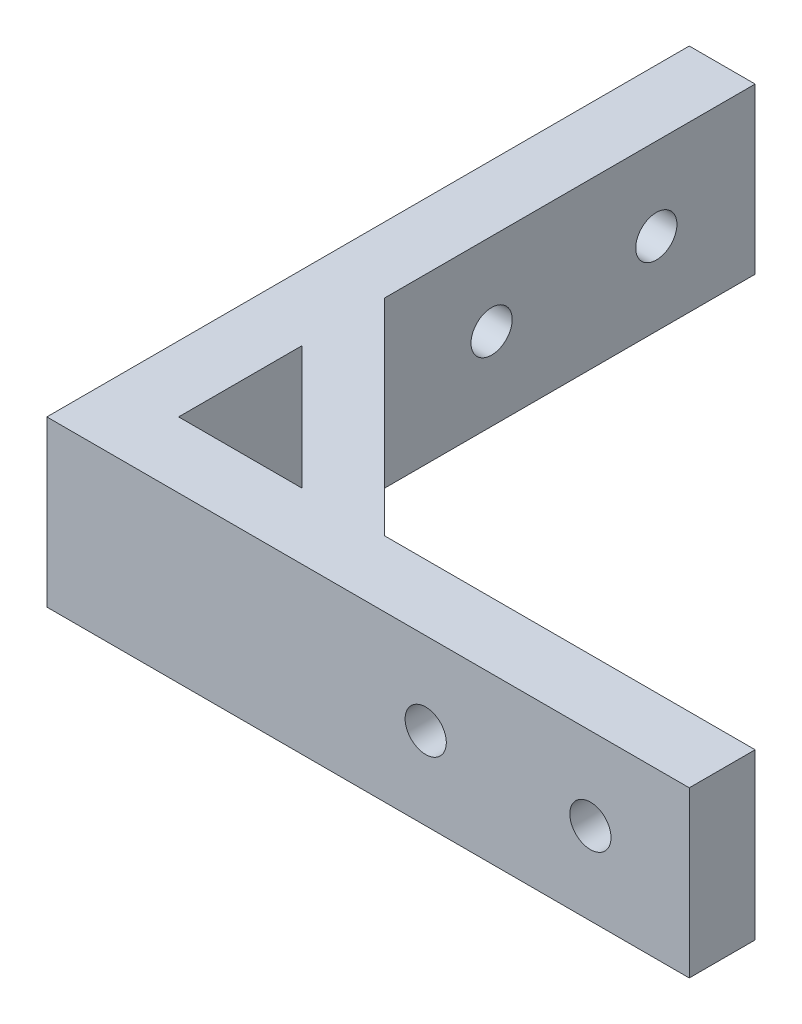
ISO-10303-21;
HEADER;
FILE_DESCRIPTION(('STEP AP214'),'2;1');
FILE_NAME('part.step','',(''),(''),'','','');
FILE_SCHEMA(('AUTOMOTIVE_DESIGN { 1 0 10303 214 1 1 1 1 }'));
ENDSEC;
DATA;
#1=APPLICATION_CONTEXT('core data for automotive mechanical design processes');
#2=APPLICATION_PROTOCOL_DEFINITION('international standard','automotive_design',2000,#1);
#3=PRODUCT_CONTEXT('',#1,'mechanical');
#4=PRODUCT('Part','Part','',(#3));
#5=PRODUCT_RELATED_PRODUCT_CATEGORY('part','',(#4));
#6=PRODUCT_DEFINITION_FORMATION('','',#4);
#7=PRODUCT_DEFINITION_CONTEXT('part definition',#1,'design');
#8=PRODUCT_DEFINITION('design','',#6,#7);
#9=PRODUCT_DEFINITION_SHAPE('','',#8);
#10=(LENGTH_UNIT() NAMED_UNIT(*) SI_UNIT(.MILLI.,.METRE.));
#11=(NAMED_UNIT(*) PLANE_ANGLE_UNIT() SI_UNIT($,.RADIAN.));
#12=(NAMED_UNIT(*) SI_UNIT($,.STERADIAN.) SOLID_ANGLE_UNIT());
#13=UNCERTAINTY_MEASURE_WITH_UNIT(LENGTH_MEASURE(1.E-05),#10,'distance_accuracy_value','');
#14=(GEOMETRIC_REPRESENTATION_CONTEXT(3) GLOBAL_UNCERTAINTY_ASSIGNED_CONTEXT((#13)) GLOBAL_UNIT_ASSIGNED_CONTEXT((#10,
#11,#12)) REPRESENTATION_CONTEXT('',''));
#15=CARTESIAN_POINT('',(0.,0.,0.));
#16=DIRECTION('',(0.,0.,1.));
#17=DIRECTION('',(1.,0.,0.));
#18=AXIS2_PLACEMENT_3D('',#15,#16,#17);
#19=CARTESIAN_POINT('',(8.00000000000001,10.,0.));
#20=DIRECTION('',(1.,0.,0.));
#21=DIRECTION('',(0.,0.,-1.));
#22=AXIS2_PLACEMENT_3D('',#19,#20,#21);
#23=PLANE('',#22);
#24=DIRECTION('',(0.,0.,1.));
#25=VECTOR('',#24,1.);
#26=CARTESIAN_POINT('',(8.00000000000001,-10.,0.));
#27=LINE('',#26,#25);
#28=CARTESIAN_POINT('',(8.00000000000001,-10.,-23.));
#29=VERTEX_POINT('',#28);
#30=CARTESIAN_POINT('',(8.00000000000001,-10.,-7.99999999999998));
#31=VERTEX_POINT('',#30);
#32=EDGE_CURVE('E127',#29,#31,#27,.T.);
#33=ORIENTED_EDGE('',*,*,#32,.F.);
#34=DIRECTION('',(0.,-1.,0.));
#35=VECTOR('',#34,1.);
#36=CARTESIAN_POINT('',(8.00000000000001,10.,-23.));
#37=LINE('',#36,#35);
#38=CARTESIAN_POINT('',(8.00000000000001,10.,-23.));
#39=VERTEX_POINT('',#38);
#40=EDGE_CURVE('E128',#39,#29,#37,.T.);
#41=ORIENTED_EDGE('',*,*,#40,.F.);
#42=DIRECTION('',(0.,0.,1.));
#43=VECTOR('',#42,1.);
#44=CARTESIAN_POINT('',(8.00000000000001,10.,0.));
#45=LINE('',#44,#43);
#46=CARTESIAN_POINT('',(8.00000000000001,10.,-7.99999999999998));
#47=VERTEX_POINT('',#46);
#48=EDGE_CURVE('E141',#39,#47,#45,.T.);
#49=ORIENTED_EDGE('',*,*,#48,.T.);
#50=DIRECTION('',(0.,-1.,0.));
#51=VECTOR('',#50,1.);
#52=CARTESIAN_POINT('',(8.00000000000001,10.,-7.99999999999998));
#53=LINE('',#52,#51);
#54=EDGE_CURVE('E157',#47,#31,#53,.T.);
#55=ORIENTED_EDGE('',*,*,#54,.T.);
#56=EDGE_LOOP('',(#33,#41,#49,#55));
#57=FACE_BOUND('',#56,.T.);
#58=ADVANCED_FACE('F39',(#57),#23,.T.);
#59=CARTESIAN_POINT('',(0.,10.,-7.99999999999998));
#60=DIRECTION('',(0.,0.,1.));
#61=DIRECTION('',(1.,0.,0.));
#62=AXIS2_PLACEMENT_3D('',#59,#60,#61);
#63=PLANE('',#62);
#64=DIRECTION('',(0.,-1.,0.));
#65=VECTOR('',#64,1.);
#66=CARTESIAN_POINT('',(23.,10.,-7.99999999999999));
#67=LINE('',#66,#65);
#68=CARTESIAN_POINT('',(23.,10.,-7.99999999999999));
#69=VERTEX_POINT('',#68);
#70=CARTESIAN_POINT('',(23.,-10.,-7.99999999999999));
#71=VERTEX_POINT('',#70);
#72=EDGE_CURVE('E248',#69,#71,#67,.T.);
#73=ORIENTED_EDGE('',*,*,#72,.T.);
#74=DIRECTION('',(-1.,0.,0.));
#75=VECTOR('',#74,1.);
#76=CARTESIAN_POINT('',(0.,-10.,-7.99999999999998));
#77=LINE('',#76,#75);
#78=EDGE_CURVE('E171',#71,#31,#77,.T.);
#79=ORIENTED_EDGE('',*,*,#78,.T.);
#80=ORIENTED_EDGE('',*,*,#54,.F.);
#81=DIRECTION('',(-1.,0.,0.));
#82=VECTOR('',#81,1.);
#83=CARTESIAN_POINT('',(0.,10.,-7.99999999999998));
#84=LINE('',#83,#82);
#85=EDGE_CURVE('E54',#69,#47,#84,.T.);
#86=ORIENTED_EDGE('',*,*,#85,.F.);
#87=EDGE_LOOP('',(#73,#79,#80,#86));
#88=FACE_BOUND('',#87,.T.);
#89=ADVANCED_FACE('F203',(#88),#63,.F.);
#90=CARTESIAN_POINT('',(8.00000000000001,0.,-46.));
#91=DIRECTION('',(1.,0.,0.));
#92=DIRECTION('',(0.,0.,-1.));
#93=AXIS2_PLACEMENT_3D('',#90,#91,#92);
#94=CIRCLE('',#93,2.5);
#95=CARTESIAN_POINT('',(8.00000000000001,0.,-48.5));
#96=VERTEX_POINT('',#95);
#97=EDGE_CURVE('E229',#96,#96,#94,.T.);
#98=ORIENTED_EDGE('',*,*,#97,.F.);
#99=EDGE_LOOP('',(#98));
#100=FACE_BOUND('',#99,.T.);
#101=CARTESIAN_POINT('',(8.00000000000001,0.,-66.));
#102=DIRECTION('',(1.,0.,0.));
#103=DIRECTION('',(0.,0.,-1.));
#104=AXIS2_PLACEMENT_3D('',#101,#102,#103);
#105=CIRCLE('',#104,2.49999999999999);
#106=CARTESIAN_POINT('',(8.00000000000001,0.,-68.5));
#107=VERTEX_POINT('',#106);
#108=EDGE_CURVE('E232',#107,#107,#105,.T.);
#109=ORIENTED_EDGE('',*,*,#108,.F.);
#110=EDGE_LOOP('',(#109));
#111=FACE_BOUND('',#110,.T.);
#112=DIRECTION('',(0.,-1.,0.));
#113=VECTOR('',#112,1.);
#114=CARTESIAN_POINT('',(8.00000000000001,10.,-33.));
#115=LINE('',#114,#113);
#116=CARTESIAN_POINT('',(8.00000000000001,10.,-33.));
#117=VERTEX_POINT('',#116);
#118=CARTESIAN_POINT('',(8.00000000000001,-10.,-33.));
#119=VERTEX_POINT('',#118);
#120=EDGE_CURVE('E117',#117,#119,#115,.T.);
#121=ORIENTED_EDGE('',*,*,#120,.T.);
#122=CARTESIAN_POINT('',(8.00000000000001,-10.,-78.));
#123=VERTEX_POINT('',#122);
#124=EDGE_CURVE('E158',#123,#119,#27,.T.);
#125=ORIENTED_EDGE('',*,*,#124,.F.);
#126=DIRECTION('',(0.,-1.,0.));
#127=VECTOR('',#126,1.);
#128=CARTESIAN_POINT('',(8.00000000000001,10.,-78.));
#129=LINE('',#128,#127);
#130=CARTESIAN_POINT('',(8.00000000000001,10.,-78.));
#131=VERTEX_POINT('',#130);
#132=EDGE_CURVE('E11',#131,#123,#129,.T.);
#133=ORIENTED_EDGE('',*,*,#132,.F.);
#134=EDGE_CURVE('E133',#131,#117,#45,.T.);
#135=ORIENTED_EDGE('',*,*,#134,.T.);
#136=EDGE_LOOP('',(#121,#125,#133,#135));
#137=FACE_BOUND('',#136,.T.);
#138=ADVANCED_FACE('F41',(#100,#111,#137),#23,.T.);
#139=CARTESIAN_POINT('',(0.,10.,-78.));
#140=DIRECTION('',(0.,0.,1.));
#141=DIRECTION('',(1.,0.,0.));
#142=AXIS2_PLACEMENT_3D('',#139,#140,#141);
#143=PLANE('',#142);
#144=DIRECTION('',(-1.,0.,0.));
#145=VECTOR('',#144,1.);
#146=CARTESIAN_POINT('',(0.,-10.,-78.));
#147=LINE('',#146,#145);
#148=CARTESIAN_POINT('',(0.,-10.,-78.));
#149=VERTEX_POINT('',#148);
#150=EDGE_CURVE('E160',#123,#149,#147,.T.);
#151=ORIENTED_EDGE('',*,*,#150,.T.);
#152=DIRECTION('',(0.,-1.,0.));
#153=VECTOR('',#152,1.);
#154=CARTESIAN_POINT('',(0.,10.,-78.));
#155=LINE('',#154,#153);
#156=CARTESIAN_POINT('',(0.,10.,-78.));
#157=VERTEX_POINT('',#156);
#158=EDGE_CURVE('E47',#157,#149,#155,.T.);
#159=ORIENTED_EDGE('',*,*,#158,.F.);
#160=DIRECTION('',(-1.,0.,0.));
#161=VECTOR('',#160,1.);
#162=CARTESIAN_POINT('',(0.,10.,-78.));
#163=LINE('',#162,#161);
#164=EDGE_CURVE('E140',#131,#157,#163,.T.);
#165=ORIENTED_EDGE('',*,*,#164,.F.);
#166=ORIENTED_EDGE('',*,*,#132,.T.);
#167=EDGE_LOOP('',(#151,#159,#165,#166));
#168=FACE_BOUND('',#167,.T.);
#169=ADVANCED_FACE('F221',(#168),#143,.F.);
#170=CARTESIAN_POINT('',(0.,10.,0.));
#171=DIRECTION('',(1.,0.,0.));
#172=DIRECTION('',(0.,0.,-1.));
#173=AXIS2_PLACEMENT_3D('',#170,#171,#172);
#174=PLANE('',#173);
#175=CARTESIAN_POINT('',(0.,0.,-46.));
#176=DIRECTION('',(1.,0.,0.));
#177=DIRECTION('',(0.,0.,-1.));
#178=AXIS2_PLACEMENT_3D('',#175,#176,#177);
#179=CIRCLE('',#178,2.5);
#180=CARTESIAN_POINT('',(0.,0.,-48.5));
#181=VERTEX_POINT('',#180);
#182=EDGE_CURVE('E236',#181,#181,#179,.F.);
#183=ORIENTED_EDGE('',*,*,#182,.F.);
#184=EDGE_LOOP('',(#183));
#185=FACE_BOUND('',#184,.T.);
#186=CARTESIAN_POINT('',(0.,0.,-66.));
#187=DIRECTION('',(1.,0.,0.));
#188=DIRECTION('',(0.,0.,-1.));
#189=AXIS2_PLACEMENT_3D('',#186,#187,#188);
#190=CIRCLE('',#189,2.49999999999999);
#191=CARTESIAN_POINT('',(0.,0.,-68.5));
#192=VERTEX_POINT('',#191);
#193=EDGE_CURVE('E234',#192,#192,#190,.F.);
#194=ORIENTED_EDGE('',*,*,#193,.F.);
#195=EDGE_LOOP('',(#194));
#196=FACE_BOUND('',#195,.T.);
#197=DIRECTION('',(0.,0.,1.));
#198=VECTOR('',#197,1.);
#199=CARTESIAN_POINT('',(0.,-10.,0.));
#200=LINE('',#199,#198);
#201=CARTESIAN_POINT('',(0.,-10.,0.));
#202=VERTEX_POINT('',#201);
#203=EDGE_CURVE('E162',#149,#202,#200,.T.);
#204=ORIENTED_EDGE('',*,*,#203,.T.);
#205=DIRECTION('',(0.,-1.,0.));
#206=VECTOR('',#205,1.);
#207=CARTESIAN_POINT('',(0.,10.,0.));
#208=LINE('',#207,#206);
#209=CARTESIAN_POINT('',(0.,10.,0.));
#210=VERTEX_POINT('',#209);
#211=EDGE_CURVE('E179',#210,#202,#208,.T.);
#212=ORIENTED_EDGE('',*,*,#211,.F.);
#213=DIRECTION('',(0.,0.,1.));
#214=VECTOR('',#213,1.);
#215=CARTESIAN_POINT('',(0.,10.,0.));
#216=LINE('',#215,#214);
#217=EDGE_CURVE('E143',#157,#210,#216,.T.);
#218=ORIENTED_EDGE('',*,*,#217,.F.);
#219=ORIENTED_EDGE('',*,*,#158,.T.);
#220=EDGE_LOOP('',(#204,#212,#218,#219));
#221=FACE_BOUND('',#220,.T.);
#222=ADVANCED_FACE('F185',(#185,#196,#221),#174,.F.);
#223=CARTESIAN_POINT('',(0.,10.,0.));
#224=DIRECTION('',(0.,0.,1.));
#225=DIRECTION('',(1.,0.,0.));
#226=AXIS2_PLACEMENT_3D('',#223,#224,#225);
#227=PLANE('',#226);
#228=CARTESIAN_POINT('',(66.,0.,0.));
#229=DIRECTION('',(0.,0.,1.));
#230=DIRECTION('',(1.,0.,0.));
#231=AXIS2_PLACEMENT_3D('',#228,#229,#230);
#232=CIRCLE('',#231,2.5);
#233=CARTESIAN_POINT('',(63.5,0.,0.));
#234=VERTEX_POINT('',#233);
#235=EDGE_CURVE('E239',#234,#234,#232,.F.);
#236=ORIENTED_EDGE('',*,*,#235,.T.);
#237=EDGE_LOOP('',(#236));
#238=FACE_BOUND('',#237,.T.);
#239=CARTESIAN_POINT('',(46.,0.,0.));
#240=DIRECTION('',(0.,0.,1.));
#241=DIRECTION('',(1.,0.,0.));
#242=AXIS2_PLACEMENT_3D('',#239,#240,#241);
#243=CIRCLE('',#242,2.5);
#244=CARTESIAN_POINT('',(43.5,0.,0.));
#245=VERTEX_POINT('',#244);
#246=EDGE_CURVE('E292',#245,#245,#243,.F.);
#247=ORIENTED_EDGE('',*,*,#246,.T.);
#248=EDGE_LOOP('',(#247));
#249=FACE_BOUND('',#248,.T.);
#250=DIRECTION('',(-1.,0.,0.));
#251=VECTOR('',#250,1.);
#252=CARTESIAN_POINT('',(0.,-10.,0.));
#253=LINE('',#252,#251);
#254=CARTESIAN_POINT('',(78.,-10.,0.));
#255=VERTEX_POINT('',#254);
#256=EDGE_CURVE('E165',#255,#202,#253,.T.);
#257=ORIENTED_EDGE('',*,*,#256,.F.);
#258=DIRECTION('',(0.,-1.,0.));
#259=VECTOR('',#258,1.);
#260=CARTESIAN_POINT('',(78.,10.,0.));
#261=LINE('',#260,#259);
#262=CARTESIAN_POINT('',(78.,10.,0.));
#263=VERTEX_POINT('',#262);
#264=EDGE_CURVE('E177',#263,#255,#261,.T.);
#265=ORIENTED_EDGE('',*,*,#264,.F.);
#266=DIRECTION('',(-1.,0.,0.));
#267=VECTOR('',#266,1.);
#268=CARTESIAN_POINT('',(0.,10.,0.));
#269=LINE('',#268,#267);
#270=EDGE_CURVE('E150',#263,#210,#269,.T.);
#271=ORIENTED_EDGE('',*,*,#270,.T.);
#272=ORIENTED_EDGE('',*,*,#211,.T.);
#273=EDGE_LOOP('',(#257,#265,#271,#272));
#274=FACE_BOUND('',#273,.T.);
#275=ADVANCED_FACE('F195',(#238,#249,#274),#227,.T.);
#276=CARTESIAN_POINT('',(78.,10.,0.));
#277=DIRECTION('',(1.,0.,0.));
#278=DIRECTION('',(0.,0.,-1.));
#279=AXIS2_PLACEMENT_3D('',#276,#277,#278);
#280=PLANE('',#279);
#281=DIRECTION('',(0.,0.,1.));
#282=VECTOR('',#281,1.);
#283=CARTESIAN_POINT('',(78.,-10.,0.));
#284=LINE('',#283,#282);
#285=CARTESIAN_POINT('',(78.,-10.,-7.99999999999999));
#286=VERTEX_POINT('',#285);
#287=EDGE_CURVE('E168',#286,#255,#284,.T.);
#288=ORIENTED_EDGE('',*,*,#287,.F.);
#289=DIRECTION('',(0.,-1.,0.));
#290=VECTOR('',#289,1.);
#291=CARTESIAN_POINT('',(78.,10.,-7.99999999999999));
#292=LINE('',#291,#290);
#293=CARTESIAN_POINT('',(78.,10.,-7.99999999999999));
#294=VERTEX_POINT('',#293);
#295=EDGE_CURVE('E175',#294,#286,#292,.T.);
#296=ORIENTED_EDGE('',*,*,#295,.F.);
#297=DIRECTION('',(0.,0.,1.));
#298=VECTOR('',#297,1.);
#299=CARTESIAN_POINT('',(78.,10.,0.));
#300=LINE('',#299,#298);
#301=EDGE_CURVE('E153',#294,#263,#300,.T.);
#302=ORIENTED_EDGE('',*,*,#301,.T.);
#303=ORIENTED_EDGE('',*,*,#264,.T.);
#304=EDGE_LOOP('',(#288,#296,#302,#303));
#305=FACE_BOUND('',#304,.T.);
#306=ADVANCED_FACE('F198',(#305),#280,.T.);
#307=CARTESIAN_POINT('',(66.,0.,-7.99999999999999));
#308=DIRECTION('',(0.,0.,-1.));
#309=DIRECTION('',(-1.,0.,0.));
#310=AXIS2_PLACEMENT_3D('',#307,#308,#309);
#311=CIRCLE('',#310,2.5);
#312=CARTESIAN_POINT('',(63.5,0.,-7.99999999999999));
#313=VERTEX_POINT('',#312);
#314=EDGE_CURVE('E284',#313,#313,#311,.T.);
#315=ORIENTED_EDGE('',*,*,#314,.F.);
#316=EDGE_LOOP('',(#315));
#317=FACE_BOUND('',#316,.T.);
#318=CARTESIAN_POINT('',(46.,0.,-7.99999999999999));
#319=DIRECTION('',(0.,0.,-1.));
#320=DIRECTION('',(-1.,0.,0.));
#321=AXIS2_PLACEMENT_3D('',#318,#319,#320);
#322=CIRCLE('',#321,2.5);
#323=CARTESIAN_POINT('',(43.5,0.,-7.99999999999999));
#324=VERTEX_POINT('',#323);
#325=EDGE_CURVE('E289',#324,#324,#322,.T.);
#326=ORIENTED_EDGE('',*,*,#325,.F.);
#327=EDGE_LOOP('',(#326));
#328=FACE_BOUND('',#327,.T.);
#329=CARTESIAN_POINT('',(33.,-10.,-7.99999999999999));
#330=VERTEX_POINT('',#329);
#331=EDGE_CURVE('E146',#286,#330,#77,.T.);
#332=ORIENTED_EDGE('',*,*,#331,.T.);
#333=DIRECTION('',(0.,-1.,0.));
#334=VECTOR('',#333,1.);
#335=CARTESIAN_POINT('',(33.,10.,-7.99999999999999));
#336=LINE('',#335,#334);
#337=CARTESIAN_POINT('',(33.,10.,-7.99999999999999));
#338=VERTEX_POINT('',#337);
#339=EDGE_CURVE('E62',#338,#330,#336,.T.);
#340=ORIENTED_EDGE('',*,*,#339,.F.);
#341=EDGE_CURVE('E135',#294,#338,#84,.T.);
#342=ORIENTED_EDGE('',*,*,#341,.F.);
#343=ORIENTED_EDGE('',*,*,#295,.T.);
#344=EDGE_LOOP('',(#332,#340,#342,#343));
#345=FACE_BOUND('',#344,.T.);
#346=ADVANCED_FACE('F199',(#317,#328,#345),#63,.F.);
#347=CARTESIAN_POINT('',(0.,10.,0.));
#348=DIRECTION('',(0.,1.,0.));
#349=DIRECTION('',(0.,0.,1.));
#350=AXIS2_PLACEMENT_3D('',#347,#348,#349);
#351=PLANE('',#350);
#352=ORIENTED_EDGE('',*,*,#48,.F.);
#353=DIRECTION('',(0.707106781186548,0.,0.707106781186547));
#354=VECTOR('',#353,1.);
#355=CARTESIAN_POINT('',(15.5,10.,-15.5));
#356=LINE('',#355,#354);
#357=EDGE_CURVE('E136',#39,#69,#356,.T.);
#358=ORIENTED_EDGE('',*,*,#357,.T.);
#359=ORIENTED_EDGE('',*,*,#85,.T.);
#360=EDGE_LOOP('',(#352,#358,#359));
#361=FACE_BOUND('',#360,.T.);
#362=ORIENTED_EDGE('',*,*,#134,.F.);
#363=ORIENTED_EDGE('',*,*,#164,.T.);
#364=ORIENTED_EDGE('',*,*,#217,.T.);
#365=ORIENTED_EDGE('',*,*,#270,.F.);
#366=ORIENTED_EDGE('',*,*,#301,.F.);
#367=ORIENTED_EDGE('',*,*,#341,.T.);
#368=DIRECTION('',(0.707106781186548,0.,0.707106781186547));
#369=VECTOR('',#368,1.);
#370=CARTESIAN_POINT('',(20.5,10.,-20.5));
#371=LINE('',#370,#369);
#372=EDGE_CURVE('E120',#117,#338,#371,.T.);
#373=ORIENTED_EDGE('',*,*,#372,.F.);
#374=EDGE_LOOP('',(#362,#363,#364,#365,#366,#367,#373));
#375=FACE_BOUND('',#374,.T.);
#376=ADVANCED_FACE('F132',(#361,#375),#351,.T.);
#377=CARTESIAN_POINT('',(0.,-10.,0.));
#378=DIRECTION('',(0.,1.,0.));
#379=DIRECTION('',(0.,0.,1.));
#380=AXIS2_PLACEMENT_3D('',#377,#378,#379);
#381=PLANE('',#380);
#382=DIRECTION('',(0.707106781186548,0.,0.707106781186547));
#383=VECTOR('',#382,1.);
#384=CARTESIAN_POINT('',(15.5,-10.,-15.5));
#385=LINE('',#384,#383);
#386=EDGE_CURVE('E137',#29,#71,#385,.T.);
#387=ORIENTED_EDGE('',*,*,#386,.F.);
#388=ORIENTED_EDGE('',*,*,#32,.T.);
#389=ORIENTED_EDGE('',*,*,#78,.F.);
#390=EDGE_LOOP('',(#387,#388,#389));
#391=FACE_BOUND('',#390,.T.);
#392=ORIENTED_EDGE('',*,*,#124,.T.);
#393=DIRECTION('',(0.707106781186548,0.,0.707106781186547));
#394=VECTOR('',#393,1.);
#395=CARTESIAN_POINT('',(20.5,-10.,-20.5));
#396=LINE('',#395,#394);
#397=EDGE_CURVE('E122',#119,#330,#396,.T.);
#398=ORIENTED_EDGE('',*,*,#397,.T.);
#399=ORIENTED_EDGE('',*,*,#331,.F.);
#400=ORIENTED_EDGE('',*,*,#287,.T.);
#401=ORIENTED_EDGE('',*,*,#256,.T.);
#402=ORIENTED_EDGE('',*,*,#203,.F.);
#403=ORIENTED_EDGE('',*,*,#150,.F.);
#404=EDGE_LOOP('',(#392,#398,#399,#400,#401,#402,#403));
#405=FACE_BOUND('',#404,.T.);
#406=ADVANCED_FACE('F190',(#391,#405),#381,.F.);
#407=CARTESIAN_POINT('',(20.5,10.,-20.5));
#408=DIRECTION('',(0.707106781186547,0.,-0.707106781186548));
#409=DIRECTION('',(-0.707106781186548,0.,-0.707106781186547));
#410=AXIS2_PLACEMENT_3D('',#407,#408,#409);
#411=PLANE('',#410);
#412=ORIENTED_EDGE('',*,*,#397,.F.);
#413=ORIENTED_EDGE('',*,*,#120,.F.);
#414=ORIENTED_EDGE('',*,*,#372,.T.);
#415=ORIENTED_EDGE('',*,*,#339,.T.);
#416=EDGE_LOOP('',(#412,#413,#414,#415));
#417=FACE_BOUND('',#416,.T.);
#418=ADVANCED_FACE('F119',(#417),#411,.T.);
#419=CARTESIAN_POINT('',(15.5,10.,-15.5));
#420=DIRECTION('',(0.707106781186547,0.,-0.707106781186548));
#421=DIRECTION('',(-0.707106781186548,0.,-0.707106781186547));
#422=AXIS2_PLACEMENT_3D('',#419,#420,#421);
#423=PLANE('',#422);
#424=ORIENTED_EDGE('',*,*,#386,.T.);
#425=ORIENTED_EDGE('',*,*,#72,.F.);
#426=ORIENTED_EDGE('',*,*,#357,.F.);
#427=ORIENTED_EDGE('',*,*,#40,.T.);
#428=EDGE_LOOP('',(#424,#425,#426,#427));
#429=FACE_BOUND('',#428,.T.);
#430=ADVANCED_FACE('F252',(#429),#423,.F.);
#431=CARTESIAN_POINT('',(-7.07106781186548,0.,-66.));
#432=DIRECTION('',(1.,0.,0.));
#433=DIRECTION('',(0.,0.,-1.));
#434=AXIS2_PLACEMENT_3D('',#431,#432,#433);
#435=CYLINDRICAL_SURFACE('',#434,2.49999999999999);
#436=CARTESIAN_POINT('',(0.,0.,-68.5));
#437=CARTESIAN_POINT('',(0.0833333333333342,0.,-68.5));
#438=CARTESIAN_POINT('',(0.166666666666668,0.,-68.5));
#439=CARTESIAN_POINT('',(0.333333333333335,0.,-68.5));
#440=CARTESIAN_POINT('',(0.416666666666668,0.,-68.5));
#441=CARTESIAN_POINT('',(0.583333333333334,0.,-68.5));
#442=CARTESIAN_POINT('',(0.666666666666668,0.,-68.5));
#443=CARTESIAN_POINT('',(0.833333333333334,0.,-68.5));
#444=CARTESIAN_POINT('',(0.916666666666668,0.,-68.5));
#445=CARTESIAN_POINT('',(1.08333333333333,0.,-68.5));
#446=CARTESIAN_POINT('',(1.16666666666667,0.,-68.5));
#447=CARTESIAN_POINT('',(1.33333333333333,0.,-68.5));
#448=CARTESIAN_POINT('',(1.41666666666667,0.,-68.5));
#449=CARTESIAN_POINT('',(1.58333333333333,0.,-68.5));
#450=CARTESIAN_POINT('',(1.66666666666667,0.,-68.5));
#451=CARTESIAN_POINT('',(1.83333333333334,0.,-68.5));
#452=CARTESIAN_POINT('',(1.91666666666667,0.,-68.5));
#453=CARTESIAN_POINT('',(2.08333333333334,0.,-68.5));
#454=CARTESIAN_POINT('',(2.16666666666667,0.,-68.5));
#455=CARTESIAN_POINT('',(2.33333333333334,0.,-68.5));
#456=CARTESIAN_POINT('',(2.41666666666667,0.,-68.5));
#457=CARTESIAN_POINT('',(2.58333333333334,0.,-68.5));
#458=CARTESIAN_POINT('',(2.66666666666667,0.,-68.5));
#459=CARTESIAN_POINT('',(2.83333333333334,0.,-68.5));
#460=CARTESIAN_POINT('',(2.91666666666667,0.,-68.5));
#461=CARTESIAN_POINT('',(3.08333333333333,0.,-68.5));
#462=CARTESIAN_POINT('',(3.16666666666667,0.,-68.5));
#463=CARTESIAN_POINT('',(3.33333333333333,0.,-68.5));
#464=CARTESIAN_POINT('',(3.41666666666667,0.,-68.5));
#465=CARTESIAN_POINT('',(3.58333333333333,0.,-68.5));
#466=CARTESIAN_POINT('',(3.66666666666667,0.,-68.5));
#467=CARTESIAN_POINT('',(3.83333333333333,0.,-68.5));
#468=CARTESIAN_POINT('',(3.91666666666667,0.,-68.5));
#469=CARTESIAN_POINT('',(4.08333333333334,0.,-68.5));
#470=CARTESIAN_POINT('',(4.16666666666667,0.,-68.5));
#471=CARTESIAN_POINT('',(4.33333333333334,0.,-68.5));
#472=CARTESIAN_POINT('',(4.41666666666667,0.,-68.5));
#473=CARTESIAN_POINT('',(4.58333333333334,0.,-68.5));
#474=CARTESIAN_POINT('',(4.66666666666667,0.,-68.5));
#475=CARTESIAN_POINT('',(4.83333333333334,0.,-68.5));
#476=CARTESIAN_POINT('',(4.91666666666667,0.,-68.5));
#477=CARTESIAN_POINT('',(5.08333333333334,0.,-68.5));
#478=CARTESIAN_POINT('',(5.16666666666667,0.,-68.5));
#479=CARTESIAN_POINT('',(5.33333333333334,0.,-68.5));
#480=CARTESIAN_POINT('',(5.41666666666667,0.,-68.5));
#481=CARTESIAN_POINT('',(5.58333333333334,0.,-68.5));
#482=CARTESIAN_POINT('',(5.66666666666667,0.,-68.5));
#483=CARTESIAN_POINT('',(5.83333333333334,0.,-68.5));
#484=CARTESIAN_POINT('',(5.91666666666667,0.,-68.5));
#485=CARTESIAN_POINT('',(6.08333333333334,0.,-68.5));
#486=CARTESIAN_POINT('',(6.16666666666667,0.,-68.5));
#487=CARTESIAN_POINT('',(6.33333333333334,0.,-68.5));
#488=CARTESIAN_POINT('',(6.41666666666667,0.,-68.5));
#489=CARTESIAN_POINT('',(6.58333333333334,0.,-68.5));
#490=CARTESIAN_POINT('',(6.66666666666667,0.,-68.5));
#491=CARTESIAN_POINT('',(6.83333333333334,0.,-68.5));
#492=CARTESIAN_POINT('',(6.91666666666667,0.,-68.5));
#493=CARTESIAN_POINT('',(7.08333333333334,0.,-68.5));
#494=CARTESIAN_POINT('',(7.16666666666667,0.,-68.5));
#495=CARTESIAN_POINT('',(7.33333333333334,0.,-68.5));
#496=CARTESIAN_POINT('',(7.41666666666667,0.,-68.5));
#497=CARTESIAN_POINT('',(7.58333333333334,0.,-68.5));
#498=CARTESIAN_POINT('',(7.66666666666667,0.,-68.5));
#499=CARTESIAN_POINT('',(7.83333333333334,0.,-68.5));
#500=CARTESIAN_POINT('',(7.91666666666667,0.,-68.5));
#501=CARTESIAN_POINT('',(8.00000000000001,0.,-68.5));
#502=B_SPLINE_CURVE_WITH_KNOTS('',3,(#436,#437,#438,#439,#440,#441,#442,#443,#444,#445,#446,
#447,#448,#449,#450,#451,#452,#453,#454,#455,#456,#457,#458,#459,#460,#461,#462,#463,#464,#465,
#466,#467,#468,#469,#470,#471,#472,#473,#474,#475,#476,#477,#478,#479,#480,#481,#482,#483,#484,
#485,#486,#487,#488,#489,#490,#491,#492,#493,#494,#495,#496,#497,#498,#499,#500,#501),
.UNSPECIFIED.,.F.,.F.,(4,2,2,2,2,2,2,2,2,2,2,2,2,2,2,2,2,2,2,2,2,2,2,2,2,2,2,2,2,2,2,2,4),(0.,
0.25,0.5,0.75,1.,1.25,1.5,1.75,2.,2.25,2.5,2.75,3.,3.25,3.5,3.75,4.,4.25,4.5,4.75,5.,5.25,5.5,
5.75,6.,6.25,6.5,6.75,7.,7.25,7.5,7.75,8.),.UNSPECIFIED.);
#503=EDGE_CURVE('BSEAM265',#192,#107,#502,.T.);
#504=ORIENTED_EDGE('',*,*,#193,.T.);
#505=ORIENTED_EDGE('',*,*,#108,.T.);
#506=ORIENTED_EDGE('',*,*,#503,.T.);
#507=ORIENTED_EDGE('',*,*,#503,.F.);
#508=EDGE_LOOP('',(#504,#506,#505,#507));
#509=FACE_BOUND('',#508,.T.);
#510=ADVANCED_FACE('F265',(#509),#435,.F.);
#511=CARTESIAN_POINT('',(-7.07106781186548,0.,-46.));
#512=DIRECTION('',(1.,0.,0.));
#513=DIRECTION('',(0.,0.,-1.));
#514=AXIS2_PLACEMENT_3D('',#511,#512,#513);
#515=CYLINDRICAL_SURFACE('',#514,2.5);
#516=CARTESIAN_POINT('',(0.,0.,-48.5));
#517=CARTESIAN_POINT('',(0.0833333333333342,0.,-48.5));
#518=CARTESIAN_POINT('',(0.166666666666668,0.,-48.5));
#519=CARTESIAN_POINT('',(0.333333333333335,0.,-48.5));
#520=CARTESIAN_POINT('',(0.416666666666668,0.,-48.5));
#521=CARTESIAN_POINT('',(0.583333333333334,0.,-48.5));
#522=CARTESIAN_POINT('',(0.666666666666668,0.,-48.5));
#523=CARTESIAN_POINT('',(0.833333333333334,0.,-48.5));
#524=CARTESIAN_POINT('',(0.916666666666668,0.,-48.5));
#525=CARTESIAN_POINT('',(1.08333333333333,0.,-48.5));
#526=CARTESIAN_POINT('',(1.16666666666667,0.,-48.5));
#527=CARTESIAN_POINT('',(1.33333333333333,0.,-48.5));
#528=CARTESIAN_POINT('',(1.41666666666667,0.,-48.5));
#529=CARTESIAN_POINT('',(1.58333333333333,0.,-48.5));
#530=CARTESIAN_POINT('',(1.66666666666667,0.,-48.5));
#531=CARTESIAN_POINT('',(1.83333333333334,0.,-48.5));
#532=CARTESIAN_POINT('',(1.91666666666667,0.,-48.5));
#533=CARTESIAN_POINT('',(2.08333333333334,0.,-48.5));
#534=CARTESIAN_POINT('',(2.16666666666667,0.,-48.5));
#535=CARTESIAN_POINT('',(2.33333333333334,0.,-48.5));
#536=CARTESIAN_POINT('',(2.41666666666667,0.,-48.5));
#537=CARTESIAN_POINT('',(2.58333333333334,0.,-48.5));
#538=CARTESIAN_POINT('',(2.66666666666667,0.,-48.5));
#539=CARTESIAN_POINT('',(2.83333333333334,0.,-48.5));
#540=CARTESIAN_POINT('',(2.91666666666667,0.,-48.5));
#541=CARTESIAN_POINT('',(3.08333333333333,0.,-48.5));
#542=CARTESIAN_POINT('',(3.16666666666667,0.,-48.5));
#543=CARTESIAN_POINT('',(3.33333333333333,0.,-48.5));
#544=CARTESIAN_POINT('',(3.41666666666667,0.,-48.5));
#545=CARTESIAN_POINT('',(3.58333333333333,0.,-48.5));
#546=CARTESIAN_POINT('',(3.66666666666667,0.,-48.5));
#547=CARTESIAN_POINT('',(3.83333333333333,0.,-48.5));
#548=CARTESIAN_POINT('',(3.91666666666667,0.,-48.5));
#549=CARTESIAN_POINT('',(4.08333333333334,0.,-48.5));
#550=CARTESIAN_POINT('',(4.16666666666667,0.,-48.5));
#551=CARTESIAN_POINT('',(4.33333333333334,0.,-48.5));
#552=CARTESIAN_POINT('',(4.41666666666667,0.,-48.5));
#553=CARTESIAN_POINT('',(4.58333333333334,0.,-48.5));
#554=CARTESIAN_POINT('',(4.66666666666667,0.,-48.5));
#555=CARTESIAN_POINT('',(4.83333333333334,0.,-48.5));
#556=CARTESIAN_POINT('',(4.91666666666667,0.,-48.5));
#557=CARTESIAN_POINT('',(5.08333333333334,0.,-48.5));
#558=CARTESIAN_POINT('',(5.16666666666667,0.,-48.5));
#559=CARTESIAN_POINT('',(5.33333333333334,0.,-48.5));
#560=CARTESIAN_POINT('',(5.41666666666667,0.,-48.5));
#561=CARTESIAN_POINT('',(5.58333333333334,0.,-48.5));
#562=CARTESIAN_POINT('',(5.66666666666667,0.,-48.5));
#563=CARTESIAN_POINT('',(5.83333333333334,0.,-48.5));
#564=CARTESIAN_POINT('',(5.91666666666667,0.,-48.5));
#565=CARTESIAN_POINT('',(6.08333333333334,0.,-48.5));
#566=CARTESIAN_POINT('',(6.16666666666667,0.,-48.5));
#567=CARTESIAN_POINT('',(6.33333333333334,0.,-48.5));
#568=CARTESIAN_POINT('',(6.41666666666667,0.,-48.5));
#569=CARTESIAN_POINT('',(6.58333333333334,0.,-48.5));
#570=CARTESIAN_POINT('',(6.66666666666667,0.,-48.5));
#571=CARTESIAN_POINT('',(6.83333333333334,0.,-48.5));
#572=CARTESIAN_POINT('',(6.91666666666667,0.,-48.5));
#573=CARTESIAN_POINT('',(7.08333333333334,0.,-48.5));
#574=CARTESIAN_POINT('',(7.16666666666667,0.,-48.5));
#575=CARTESIAN_POINT('',(7.33333333333334,0.,-48.5));
#576=CARTESIAN_POINT('',(7.41666666666667,0.,-48.5));
#577=CARTESIAN_POINT('',(7.58333333333334,0.,-48.5));
#578=CARTESIAN_POINT('',(7.66666666666667,0.,-48.5));
#579=CARTESIAN_POINT('',(7.83333333333334,0.,-48.5));
#580=CARTESIAN_POINT('',(7.91666666666667,0.,-48.5));
#581=CARTESIAN_POINT('',(8.00000000000001,0.,-48.5));
#582=B_SPLINE_CURVE_WITH_KNOTS('',3,(#516,#517,#518,#519,#520,#521,#522,#523,#524,#525,#526,
#527,#528,#529,#530,#531,#532,#533,#534,#535,#536,#537,#538,#539,#540,#541,#542,#543,#544,#545,
#546,#547,#548,#549,#550,#551,#552,#553,#554,#555,#556,#557,#558,#559,#560,#561,#562,#563,#564,
#565,#566,#567,#568,#569,#570,#571,#572,#573,#574,#575,#576,#577,#578,#579,#580,#581),
.UNSPECIFIED.,.F.,.F.,(4,2,2,2,2,2,2,2,2,2,2,2,2,2,2,2,2,2,2,2,2,2,2,2,2,2,2,2,2,2,2,2,4),(0.,
0.25,0.5,0.75,1.,1.25,1.5,1.75,2.,2.25,2.5,2.75,3.,3.25,3.5,3.75,4.,4.25,4.5,4.75,5.,5.25,5.5,
5.75,6.,6.25,6.5,6.75,7.,7.25,7.5,7.75,8.),.UNSPECIFIED.);
#583=EDGE_CURVE('BSEAM268',#181,#96,#582,.T.);
#584=ORIENTED_EDGE('',*,*,#182,.T.);
#585=ORIENTED_EDGE('',*,*,#97,.T.);
#586=ORIENTED_EDGE('',*,*,#583,.T.);
#587=ORIENTED_EDGE('',*,*,#583,.F.);
#588=EDGE_LOOP('',(#584,#586,#585,#587));
#589=FACE_BOUND('',#588,.T.);
#590=ADVANCED_FACE('F268',(#589),#515,.F.);
#591=CARTESIAN_POINT('',(46.,0.,7.07106781186549));
#592=DIRECTION('',(0.,0.,-1.));
#593=DIRECTION('',(-1.,0.,0.));
#594=AXIS2_PLACEMENT_3D('',#591,#592,#593);
#595=CYLINDRICAL_SURFACE('',#594,2.5);
#596=CARTESIAN_POINT('',(43.5,0.,-7.99999999999999));
#597=CARTESIAN_POINT('',(43.5,0.,-7.91666666666666));
#598=CARTESIAN_POINT('',(43.5,0.,-7.83333333333332));
#599=CARTESIAN_POINT('',(43.5,0.,-7.66666666666665));
#600=CARTESIAN_POINT('',(43.5,0.,-7.58333333333332));
#601=CARTESIAN_POINT('',(43.5,0.,-7.41666666666665));
#602=CARTESIAN_POINT('',(43.5,0.,-7.33333333333332));
#603=CARTESIAN_POINT('',(43.5,0.,-7.16666666666666));
#604=CARTESIAN_POINT('',(43.5,0.,-7.08333333333332));
#605=CARTESIAN_POINT('',(43.5,0.,-6.91666666666666));
#606=CARTESIAN_POINT('',(43.5,0.,-6.83333333333332));
#607=CARTESIAN_POINT('',(43.5,0.,-6.66666666666666));
#608=CARTESIAN_POINT('',(43.5,0.,-6.58333333333332));
#609=CARTESIAN_POINT('',(43.5,0.,-6.41666666666666));
#610=CARTESIAN_POINT('',(43.5,0.,-6.33333333333332));
#611=CARTESIAN_POINT('',(43.5,0.,-6.16666666666666));
#612=CARTESIAN_POINT('',(43.5,0.,-6.08333333333332));
#613=CARTESIAN_POINT('',(43.5,0.,-5.91666666666666));
#614=CARTESIAN_POINT('',(43.5,0.,-5.83333333333332));
#615=CARTESIAN_POINT('',(43.5,0.,-5.66666666666666));
#616=CARTESIAN_POINT('',(43.5,0.,-5.58333333333332));
#617=CARTESIAN_POINT('',(43.5,0.,-5.41666666666666));
#618=CARTESIAN_POINT('',(43.5,0.,-5.33333333333332));
#619=CARTESIAN_POINT('',(43.5,0.,-5.16666666666666));
#620=CARTESIAN_POINT('',(43.5,0.,-5.08333333333332));
#621=CARTESIAN_POINT('',(43.5,0.,-4.91666666666666));
#622=CARTESIAN_POINT('',(43.5,0.,-4.83333333333332));
#623=CARTESIAN_POINT('',(43.5,0.,-4.66666666666666));
#624=CARTESIAN_POINT('',(43.5,0.,-4.58333333333333));
#625=CARTESIAN_POINT('',(43.5,0.,-4.41666666666666));
#626=CARTESIAN_POINT('',(43.5,0.,-4.33333333333333));
#627=CARTESIAN_POINT('',(43.5,0.,-4.16666666666666));
#628=CARTESIAN_POINT('',(43.5,0.,-4.08333333333333));
#629=CARTESIAN_POINT('',(43.5,0.,-3.91666666666666));
#630=CARTESIAN_POINT('',(43.5,0.,-3.83333333333332));
#631=CARTESIAN_POINT('',(43.5,0.,-3.66666666666666));
#632=CARTESIAN_POINT('',(43.5,0.,-3.58333333333332));
#633=CARTESIAN_POINT('',(43.5,0.,-3.41666666666666));
#634=CARTESIAN_POINT('',(43.5,0.,-3.33333333333333));
#635=CARTESIAN_POINT('',(43.5,0.,-3.16666666666666));
#636=CARTESIAN_POINT('',(43.5,0.,-3.08333333333333));
#637=CARTESIAN_POINT('',(43.5,0.,-2.91666666666666));
#638=CARTESIAN_POINT('',(43.5,0.,-2.83333333333333));
#639=CARTESIAN_POINT('',(43.5,0.,-2.66666666666666));
#640=CARTESIAN_POINT('',(43.5,0.,-2.58333333333333));
#641=CARTESIAN_POINT('',(43.5,0.,-2.41666666666666));
#642=CARTESIAN_POINT('',(43.5,0.,-2.33333333333333));
#643=CARTESIAN_POINT('',(43.5,0.,-2.16666666666666));
#644=CARTESIAN_POINT('',(43.5,0.,-2.08333333333333));
#645=CARTESIAN_POINT('',(43.5,0.,-1.91666666666666));
#646=CARTESIAN_POINT('',(43.5,0.,-1.83333333333333));
#647=CARTESIAN_POINT('',(43.5,0.,-1.66666666666666));
#648=CARTESIAN_POINT('',(43.5,0.,-1.58333333333333));
#649=CARTESIAN_POINT('',(43.5,0.,-1.41666666666666));
#650=CARTESIAN_POINT('',(43.5,0.,-1.33333333333333));
#651=CARTESIAN_POINT('',(43.5,0.,-1.16666666666666));
#652=CARTESIAN_POINT('',(43.5,0.,-1.08333333333333));
#653=CARTESIAN_POINT('',(43.5,0.,-0.916666666666661));
#654=CARTESIAN_POINT('',(43.5,0.,-0.833333333333327));
#655=CARTESIAN_POINT('',(43.5,0.,-0.666666666666661));
#656=CARTESIAN_POINT('',(43.5,0.,-0.583333333333328));
#657=CARTESIAN_POINT('',(43.5,0.,-0.416666666666662));
#658=CARTESIAN_POINT('',(43.5,0.,-0.333333333333329));
#659=CARTESIAN_POINT('',(43.5,0.,-0.166666666666662));
#660=CARTESIAN_POINT('',(43.5,0.,-0.083333333333329));
#661=CARTESIAN_POINT('',(43.5,0.,0.));
#662=B_SPLINE_CURVE_WITH_KNOTS('',3,(#596,#597,#598,#599,#600,#601,#602,#603,#604,#605,#606,
#607,#608,#609,#610,#611,#612,#613,#614,#615,#616,#617,#618,#619,#620,#621,#622,#623,#624,#625,
#626,#627,#628,#629,#630,#631,#632,#633,#634,#635,#636,#637,#638,#639,#640,#641,#642,#643,#644,
#645,#646,#647,#648,#649,#650,#651,#652,#653,#654,#655,#656,#657,#658,#659,#660,#661),
.UNSPECIFIED.,.F.,.F.,(4,2,2,2,2,2,2,2,2,2,2,2,2,2,2,2,2,2,2,2,2,2,2,2,2,2,2,2,2,2,2,2,4),(0.,
0.25,0.5,0.749999999999999,0.999999999999999,1.25,1.5,1.75,2.,2.25,2.5,2.75,3.,3.25,3.5,3.75,4.,
4.25,4.5,4.75,5.,5.25,5.49999999999999,5.74999999999999,5.99999999999999,6.25,6.5,
6.74999999999999,6.99999999999999,7.24999999999999,7.49999999999999,7.74999999999999,
7.99999999999999),.UNSPECIFIED.);
#663=EDGE_CURVE('BSEAM272',#324,#245,#662,.T.);
#664=ORIENTED_EDGE('',*,*,#325,.T.);
#665=ORIENTED_EDGE('',*,*,#246,.F.);
#666=ORIENTED_EDGE('',*,*,#663,.T.);
#667=ORIENTED_EDGE('',*,*,#663,.F.);
#668=EDGE_LOOP('',(#664,#666,#665,#667));
#669=FACE_BOUND('',#668,.T.);
#670=ADVANCED_FACE('F272',(#669),#595,.F.);
#671=CARTESIAN_POINT('',(66.,0.,7.07106781186548));
#672=DIRECTION('',(0.,0.,-1.));
#673=DIRECTION('',(-1.,0.,0.));
#674=AXIS2_PLACEMENT_3D('',#671,#672,#673);
#675=CYLINDRICAL_SURFACE('',#674,2.5);
#676=CARTESIAN_POINT('',(63.5,0.,-7.99999999999999));
#677=CARTESIAN_POINT('',(63.5,0.,-7.91666666666666));
#678=CARTESIAN_POINT('',(63.5,0.,-7.83333333333332));
#679=CARTESIAN_POINT('',(63.5,0.,-7.66666666666666));
#680=CARTESIAN_POINT('',(63.5,0.,-7.58333333333333));
#681=CARTESIAN_POINT('',(63.5,0.,-7.41666666666666));
#682=CARTESIAN_POINT('',(63.5,0.,-7.33333333333332));
#683=CARTESIAN_POINT('',(63.5,0.,-7.16666666666666));
#684=CARTESIAN_POINT('',(63.5,0.,-7.08333333333333));
#685=CARTESIAN_POINT('',(63.5,0.,-6.91666666666666));
#686=CARTESIAN_POINT('',(63.5,0.,-6.83333333333333));
#687=CARTESIAN_POINT('',(63.5,0.,-6.66666666666666));
#688=CARTESIAN_POINT('',(63.5,0.,-6.58333333333333));
#689=CARTESIAN_POINT('',(63.5,0.,-6.41666666666666));
#690=CARTESIAN_POINT('',(63.5,0.,-6.33333333333333));
#691=CARTESIAN_POINT('',(63.5,0.,-6.16666666666666));
#692=CARTESIAN_POINT('',(63.5,0.,-6.08333333333333));
#693=CARTESIAN_POINT('',(63.5,0.,-5.91666666666666));
#694=CARTESIAN_POINT('',(63.5,0.,-5.83333333333333));
#695=CARTESIAN_POINT('',(63.5,0.,-5.66666666666666));
#696=CARTESIAN_POINT('',(63.5,0.,-5.58333333333333));
#697=CARTESIAN_POINT('',(63.5,0.,-5.41666666666666));
#698=CARTESIAN_POINT('',(63.5,0.,-5.33333333333333));
#699=CARTESIAN_POINT('',(63.5,0.,-5.16666666666666));
#700=CARTESIAN_POINT('',(63.5,0.,-5.08333333333333));
#701=CARTESIAN_POINT('',(63.5,0.,-4.91666666666666));
#702=CARTESIAN_POINT('',(63.5,0.,-4.83333333333333));
#703=CARTESIAN_POINT('',(63.5,0.,-4.66666666666666));
#704=CARTESIAN_POINT('',(63.5,0.,-4.58333333333333));
#705=CARTESIAN_POINT('',(63.5,0.,-4.41666666666666));
#706=CARTESIAN_POINT('',(63.5,0.,-4.33333333333333));
#707=CARTESIAN_POINT('',(63.5,0.,-4.16666666666666));
#708=CARTESIAN_POINT('',(63.5,0.,-4.08333333333333));
#709=CARTESIAN_POINT('',(63.5,0.,-3.91666666666666));
#710=CARTESIAN_POINT('',(63.5,0.,-3.83333333333332));
#711=CARTESIAN_POINT('',(63.5,0.,-3.66666666666666));
#712=CARTESIAN_POINT('',(63.5,0.,-3.58333333333333));
#713=CARTESIAN_POINT('',(63.5,0.,-3.41666666666666));
#714=CARTESIAN_POINT('',(63.5,0.,-3.33333333333333));
#715=CARTESIAN_POINT('',(63.5,0.,-3.16666666666666));
#716=CARTESIAN_POINT('',(63.5,0.,-3.08333333333333));
#717=CARTESIAN_POINT('',(63.5,0.,-2.91666666666666));
#718=CARTESIAN_POINT('',(63.5,0.,-2.83333333333333));
#719=CARTESIAN_POINT('',(63.5,0.,-2.66666666666666));
#720=CARTESIAN_POINT('',(63.5,0.,-2.58333333333333));
#721=CARTESIAN_POINT('',(63.5,0.,-2.41666666666666));
#722=CARTESIAN_POINT('',(63.5,0.,-2.33333333333333));
#723=CARTESIAN_POINT('',(63.5,0.,-2.16666666666666));
#724=CARTESIAN_POINT('',(63.5,0.,-2.08333333333333));
#725=CARTESIAN_POINT('',(63.5,0.,-1.91666666666666));
#726=CARTESIAN_POINT('',(63.5,0.,-1.83333333333333));
#727=CARTESIAN_POINT('',(63.5,0.,-1.66666666666666));
#728=CARTESIAN_POINT('',(63.5,0.,-1.58333333333333));
#729=CARTESIAN_POINT('',(63.5,0.,-1.41666666666666));
#730=CARTESIAN_POINT('',(63.5,0.,-1.33333333333333));
#731=CARTESIAN_POINT('',(63.5,0.,-1.16666666666666));
#732=CARTESIAN_POINT('',(63.5,0.,-1.08333333333333));
#733=CARTESIAN_POINT('',(63.5,0.,-0.916666666666659));
#734=CARTESIAN_POINT('',(63.5,0.,-0.833333333333325));
#735=CARTESIAN_POINT('',(63.5,0.,-0.666666666666659));
#736=CARTESIAN_POINT('',(63.5,0.,-0.583333333333326));
#737=CARTESIAN_POINT('',(63.5,0.,-0.41666666666666));
#738=CARTESIAN_POINT('',(63.5,0.,-0.333333333333327));
#739=CARTESIAN_POINT('',(63.5,0.,-0.166666666666661));
#740=CARTESIAN_POINT('',(63.5,0.,-0.0833333333333273));
#741=CARTESIAN_POINT('',(63.5,0.,0.));
#742=B_SPLINE_CURVE_WITH_KNOTS('',3,(#676,#677,#678,#679,#680,#681,#682,#683,#684,#685,#686,
#687,#688,#689,#690,#691,#692,#693,#694,#695,#696,#697,#698,#699,#700,#701,#702,#703,#704,#705,
#706,#707,#708,#709,#710,#711,#712,#713,#714,#715,#716,#717,#718,#719,#720,#721,#722,#723,#724,
#725,#726,#727,#728,#729,#730,#731,#732,#733,#734,#735,#736,#737,#738,#739,#740,#741),
.UNSPECIFIED.,.F.,.F.,(4,2,2,2,2,2,2,2,2,2,2,2,2,2,2,2,2,2,2,2,2,2,2,2,2,2,2,2,2,2,2,2,4),(0.,
0.25,0.5,0.750000000000001,0.999999999999999,1.25,1.5,1.75,2.,2.25,2.5,2.75,3.,3.25,3.5,3.75,4.,
4.25,4.5,4.75,5.,5.25,5.5,5.75,6.,6.25,6.5,6.75,7.,7.25,7.5,7.75,8.),.UNSPECIFIED.);
#743=EDGE_CURVE('BSEAM276',#313,#234,#742,.T.);
#744=ORIENTED_EDGE('',*,*,#314,.T.);
#745=ORIENTED_EDGE('',*,*,#235,.F.);
#746=ORIENTED_EDGE('',*,*,#743,.T.);
#747=ORIENTED_EDGE('',*,*,#743,.F.);
#748=EDGE_LOOP('',(#744,#746,#745,#747));
#749=FACE_BOUND('',#748,.T.);
#750=ADVANCED_FACE('F276',(#749),#675,.F.);
#751=CLOSED_SHELL('',(#58,#89,#138,#169,#222,#275,#306,#346,#376,#406,#418,#430,#510,#590,#670,#750));
#752=MANIFOLD_SOLID_BREP('B2',#751);
#753=ADVANCED_BREP_SHAPE_REPRESENTATION('',(#18,#752),#14);
#754=SHAPE_DEFINITION_REPRESENTATION(#9,#753);
ENDSEC;
END-ISO-10303-21;
